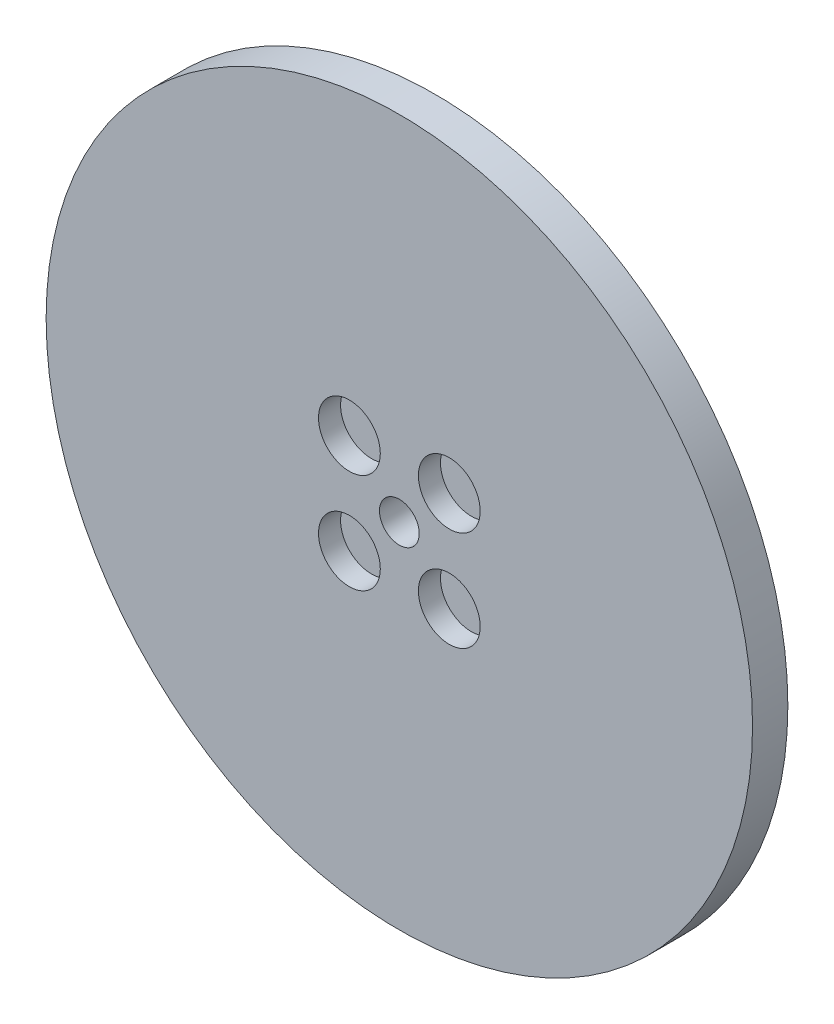
ISO-10303-21;
HEADER;
FILE_DESCRIPTION(('STEP AP214'),'2;1');
FILE_NAME('part.step','',(''),(''),'','','');
FILE_SCHEMA(('AUTOMOTIVE_DESIGN { 1 0 10303 214 1 1 1 1 }'));
ENDSEC;
DATA;
#1=APPLICATION_CONTEXT('core data for automotive mechanical design processes');
#2=APPLICATION_PROTOCOL_DEFINITION('international standard','automotive_design',2000,#1);
#3=PRODUCT_CONTEXT('',#1,'mechanical');
#4=PRODUCT('Part','Part','',(#3));
#5=PRODUCT_RELATED_PRODUCT_CATEGORY('part','',(#4));
#6=PRODUCT_DEFINITION_FORMATION('','',#4);
#7=PRODUCT_DEFINITION_CONTEXT('part definition',#1,'design');
#8=PRODUCT_DEFINITION('design','',#6,#7);
#9=PRODUCT_DEFINITION_SHAPE('','',#8);
#10=(LENGTH_UNIT() NAMED_UNIT(*) SI_UNIT(.MILLI.,.METRE.));
#11=(NAMED_UNIT(*) PLANE_ANGLE_UNIT() SI_UNIT($,.RADIAN.));
#12=(NAMED_UNIT(*) SI_UNIT($,.STERADIAN.) SOLID_ANGLE_UNIT());
#13=UNCERTAINTY_MEASURE_WITH_UNIT(LENGTH_MEASURE(1.E-05),#10,'distance_accuracy_value','');
#14=(GEOMETRIC_REPRESENTATION_CONTEXT(3) GLOBAL_UNCERTAINTY_ASSIGNED_CONTEXT((#13)) GLOBAL_UNIT_ASSIGNED_CONTEXT((#10,
#11,#12)) REPRESENTATION_CONTEXT('',''));
#15=CARTESIAN_POINT('',(0.,0.,0.));
#16=DIRECTION('',(0.,0.,1.));
#17=DIRECTION('',(1.,0.,0.));
#18=AXIS2_PLACEMENT_3D('',#15,#16,#17);
#19=CARTESIAN_POINT('',(5.65599974191923,-5.65770862800566,8.));
#20=DIRECTION('',(0.,0.,-1.));
#21=DIRECTION('',(-1.,0.,0.));
#22=AXIS2_PLACEMENT_3D('',#19,#20,#21);
#23=CYLINDRICAL_SURFACE('',#22,1.5);
#24=CARTESIAN_POINT('',(5.65599974191923,-5.65770862800566,4.));
#25=DIRECTION('',(0.,0.,1.));
#26=DIRECTION('',(1.,0.,0.));
#27=AXIS2_PLACEMENT_3D('',#24,#25,#26);
#28=CIRCLE('',#27,1.5);
#29=CARTESIAN_POINT('',(7.15599974191923,-5.65770862800566,4.));
#30=VERTEX_POINT('',#29);
#31=EDGE_CURVE('E172',#30,#30,#28,.T.);
#32=ORIENTED_EDGE('',*,*,#31,.F.);
#33=EDGE_LOOP('',(#32));
#34=FACE_BOUND('',#33,.T.);
#35=CARTESIAN_POINT('',(5.65599974191923,-5.65770862800566,5.3));
#36=DIRECTION('',(0.,0.,1.));
#37=DIRECTION('',(1.,0.,0.));
#38=AXIS2_PLACEMENT_3D('',#35,#36,#37);
#39=CIRCLE('',#38,1.5);
#40=CARTESIAN_POINT('',(7.15599974191923,-5.65770862800566,5.3));
#41=VERTEX_POINT('',#40);
#42=EDGE_CURVE('E43',#41,#41,#39,.T.);
#43=ORIENTED_EDGE('',*,*,#42,.T.);
#44=EDGE_LOOP('',(#43));
#45=FACE_BOUND('',#44,.T.);
#46=ADVANCED_FACE('F39',(#34,#45),#23,.F.);
#47=CARTESIAN_POINT('',(-5.65599974191923,-5.65770862800566,8.));
#48=DIRECTION('',(0.,0.,-1.));
#49=DIRECTION('',(-1.,0.,0.));
#50=AXIS2_PLACEMENT_3D('',#47,#48,#49);
#51=CYLINDRICAL_SURFACE('',#50,1.5);
#52=CARTESIAN_POINT('',(-5.65599974191923,-5.65770862800566,4.));
#53=DIRECTION('',(0.,0.,1.));
#54=DIRECTION('',(1.,0.,0.));
#55=AXIS2_PLACEMENT_3D('',#52,#53,#54);
#56=CIRCLE('',#55,1.5);
#57=CARTESIAN_POINT('',(-4.15599974191923,-5.65770862800566,4.));
#58=VERTEX_POINT('',#57);
#59=EDGE_CURVE('E169',#58,#58,#56,.T.);
#60=ORIENTED_EDGE('',*,*,#59,.F.);
#61=EDGE_LOOP('',(#60));
#62=FACE_BOUND('',#61,.T.);
#63=CARTESIAN_POINT('',(-5.65599974191923,-5.65770862800566,5.3));
#64=DIRECTION('',(0.,0.,1.));
#65=DIRECTION('',(1.,0.,0.));
#66=AXIS2_PLACEMENT_3D('',#63,#64,#65);
#67=CIRCLE('',#66,1.5);
#68=CARTESIAN_POINT('',(-4.15599974191923,-5.65770862800566,5.3));
#69=VERTEX_POINT('',#68);
#70=EDGE_CURVE('E63',#69,#69,#67,.T.);
#71=ORIENTED_EDGE('',*,*,#70,.T.);
#72=EDGE_LOOP('',(#71));
#73=FACE_BOUND('',#72,.T.);
#74=ADVANCED_FACE('F82',(#62,#73),#51,.F.);
#75=CARTESIAN_POINT('',(5.65599974191923,5.65770862800566,8.));
#76=DIRECTION('',(0.,0.,-1.));
#77=DIRECTION('',(-1.,0.,0.));
#78=AXIS2_PLACEMENT_3D('',#75,#76,#77);
#79=CYLINDRICAL_SURFACE('',#78,1.5);
#80=CARTESIAN_POINT('',(5.65599974191923,5.65770862800566,4.));
#81=DIRECTION('',(0.,0.,1.));
#82=DIRECTION('',(1.,0.,0.));
#83=AXIS2_PLACEMENT_3D('',#80,#81,#82);
#84=CIRCLE('',#83,1.5);
#85=CARTESIAN_POINT('',(7.15599974191923,5.65770862800566,4.));
#86=VERTEX_POINT('',#85);
#87=EDGE_CURVE('E175',#86,#86,#84,.T.);
#88=ORIENTED_EDGE('',*,*,#87,.F.);
#89=EDGE_LOOP('',(#88));
#90=FACE_BOUND('',#89,.T.);
#91=CARTESIAN_POINT('',(5.65599974191923,5.65770862800566,5.3));
#92=DIRECTION('',(0.,0.,1.));
#93=DIRECTION('',(1.,0.,0.));
#94=AXIS2_PLACEMENT_3D('',#91,#92,#93);
#95=CIRCLE('',#94,1.5);
#96=CARTESIAN_POINT('',(7.15599974191923,5.65770862800566,5.3));
#97=VERTEX_POINT('',#96);
#98=EDGE_CURVE('E61',#97,#97,#95,.T.);
#99=ORIENTED_EDGE('',*,*,#98,.T.);
#100=EDGE_LOOP('',(#99));
#101=FACE_BOUND('',#100,.T.);
#102=ADVANCED_FACE('F89',(#90,#101),#79,.F.);
#103=CARTESIAN_POINT('',(-5.65599974191923,5.65770862800566,8.));
#104=DIRECTION('',(0.,0.,-1.));
#105=DIRECTION('',(-1.,0.,0.));
#106=AXIS2_PLACEMENT_3D('',#103,#104,#105);
#107=CYLINDRICAL_SURFACE('',#106,1.5);
#108=CARTESIAN_POINT('',(-5.65599974191923,5.65770862800566,4.));
#109=DIRECTION('',(0.,0.,1.));
#110=DIRECTION('',(1.,0.,0.));
#111=AXIS2_PLACEMENT_3D('',#108,#109,#110);
#112=CIRCLE('',#111,1.5);
#113=CARTESIAN_POINT('',(-4.15599974191923,5.65770862800566,4.));
#114=VERTEX_POINT('',#113);
#115=EDGE_CURVE('E164',#114,#114,#112,.T.);
#116=ORIENTED_EDGE('',*,*,#115,.F.);
#117=EDGE_LOOP('',(#116));
#118=FACE_BOUND('',#117,.T.);
#119=CARTESIAN_POINT('',(-5.65599974191923,5.65770862800566,5.3));
#120=DIRECTION('',(0.,0.,1.));
#121=DIRECTION('',(1.,0.,0.));
#122=AXIS2_PLACEMENT_3D('',#119,#120,#121);
#123=CIRCLE('',#122,1.5);
#124=CARTESIAN_POINT('',(-4.15599974191923,5.65770862800566,5.3));
#125=VERTEX_POINT('',#124);
#126=EDGE_CURVE('E57',#125,#125,#123,.T.);
#127=ORIENTED_EDGE('',*,*,#126,.T.);
#128=EDGE_LOOP('',(#127));
#129=FACE_BOUND('',#128,.T.);
#130=ADVANCED_FACE('F96',(#118,#129),#107,.F.);
#131=CARTESIAN_POINT('',(0.,0.,0.));
#132=DIRECTION('',(0.,0.,1.));
#133=DIRECTION('',(1.,0.,0.));
#134=AXIS2_PLACEMENT_3D('',#131,#132,#133);
#135=PLANE('',#134);
#136=CARTESIAN_POINT('',(20.,0.,0.));
#137=DIRECTION('',(0.,0.,-1.));
#138=DIRECTION('',(-1.,0.,0.));
#139=AXIS2_PLACEMENT_3D('',#136,#137,#138);
#140=CIRCLE('',#139,5.15);
#141=CARTESIAN_POINT('',(14.85,0.,0.));
#142=VERTEX_POINT('',#141);
#143=EDGE_CURVE('E132',#142,#142,#140,.T.);
#144=ORIENTED_EDGE('',*,*,#143,.F.);
#145=EDGE_LOOP('',(#144));
#146=FACE_BOUND('',#145,.T.);
#147=CARTESIAN_POINT('',(0.,-20.,0.));
#148=DIRECTION('',(0.,0.,-1.));
#149=DIRECTION('',(-1.,0.,0.));
#150=AXIS2_PLACEMENT_3D('',#147,#148,#149);
#151=CIRCLE('',#150,5.15);
#152=CARTESIAN_POINT('',(-5.15000000000007,-20.,0.));
#153=VERTEX_POINT('',#152);
#154=EDGE_CURVE('E136',#153,#153,#151,.T.);
#155=ORIENTED_EDGE('',*,*,#154,.F.);
#156=EDGE_LOOP('',(#155));
#157=FACE_BOUND('',#156,.T.);
#158=CARTESIAN_POINT('',(-20.,1.39659253553725E-13,0.));
#159=DIRECTION('',(0.,0.,-1.));
#160=DIRECTION('',(-1.,0.,0.));
#161=AXIS2_PLACEMENT_3D('',#158,#159,#160);
#162=CIRCLE('',#161,5.15);
#163=CARTESIAN_POINT('',(-25.15,1.39659253553725E-13,0.));
#164=VERTEX_POINT('',#163);
#165=EDGE_CURVE('E140',#164,#164,#162,.T.);
#166=ORIENTED_EDGE('',*,*,#165,.F.);
#167=EDGE_LOOP('',(#166));
#168=FACE_BOUND('',#167,.T.);
#169=CARTESIAN_POINT('',(2.09488880330588E-13,20.,0.));
#170=DIRECTION('',(0.,0.,-1.));
#171=DIRECTION('',(-1.,0.,0.));
#172=AXIS2_PLACEMENT_3D('',#169,#170,#171);
#173=CIRCLE('',#172,5.15);
#174=CARTESIAN_POINT('',(-5.14999999999979,20.,0.));
#175=VERTEX_POINT('',#174);
#176=EDGE_CURVE('E144',#175,#175,#173,.T.);
#177=ORIENTED_EDGE('',*,*,#176,.F.);
#178=EDGE_LOOP('',(#177));
#179=FACE_BOUND('',#178,.T.);
#180=CARTESIAN_POINT('',(0.,0.,0.));
#181=DIRECTION('',(0.,0.,1.));
#182=DIRECTION('',(1.,0.,0.));
#183=AXIS2_PLACEMENT_3D('',#180,#181,#182);
#184=CIRCLE('',#183,30.);
#185=CARTESIAN_POINT('',(30.,0.,0.));
#186=VERTEX_POINT('',#185);
#187=EDGE_CURVE('E47',#186,#186,#184,.T.);
#188=ORIENTED_EDGE('',*,*,#187,.F.);
#189=EDGE_LOOP('',(#188));
#190=FACE_BOUND('',#189,.T.);
#191=CARTESIAN_POINT('',(0.,0.,0.));
#192=DIRECTION('',(0.,0.,1.));
#193=DIRECTION('',(1.,0.,0.));
#194=AXIS2_PLACEMENT_3D('',#191,#192,#193);
#195=CIRCLE('',#194,12.5);
#196=CARTESIAN_POINT('',(12.5,0.,0.));
#197=VERTEX_POINT('',#196);
#198=EDGE_CURVE('E52',#197,#197,#195,.T.);
#199=ORIENTED_EDGE('',*,*,#198,.T.);
#200=EDGE_LOOP('',(#199));
#201=FACE_BOUND('',#200,.T.);
#202=ADVANCED_FACE('F99',(#146,#157,#168,#179,#190,#201),#135,.F.);
#203=CARTESIAN_POINT('',(0.,0.,4.));
#204=DIRECTION('',(0.,0.,-1.));
#205=DIRECTION('',(-1.,0.,0.));
#206=AXIS2_PLACEMENT_3D('',#203,#204,#205);
#207=CYLINDRICAL_SURFACE('',#206,30.);
#208=CARTESIAN_POINT('',(0.,0.,4.));
#209=DIRECTION('',(0.,0.,1.));
#210=DIRECTION('',(1.,0.,0.));
#211=AXIS2_PLACEMENT_3D('',#208,#209,#210);
#212=CIRCLE('',#211,30.);
#213=CARTESIAN_POINT('',(30.,0.,4.));
#214=VERTEX_POINT('',#213);
#215=EDGE_CURVE('E10',#214,#214,#212,.T.);
#216=ORIENTED_EDGE('',*,*,#215,.F.);
#217=EDGE_LOOP('',(#216));
#218=FACE_BOUND('',#217,.T.);
#219=ORIENTED_EDGE('',*,*,#187,.T.);
#220=EDGE_LOOP('',(#219));
#221=FACE_BOUND('',#220,.T.);
#222=ADVANCED_FACE('F41',(#218,#221),#207,.T.);
#223=CARTESIAN_POINT('',(0.,0.,4.));
#224=DIRECTION('',(0.,0.,-1.));
#225=DIRECTION('',(-1.,0.,0.));
#226=AXIS2_PLACEMENT_3D('',#223,#224,#225);
#227=CYLINDRICAL_SURFACE('',#226,12.5);
#228=CARTESIAN_POINT('',(0.,0.,4.));
#229=DIRECTION('',(0.,0.,1.));
#230=DIRECTION('',(1.,0.,0.));
#231=AXIS2_PLACEMENT_3D('',#228,#229,#230);
#232=CIRCLE('',#231,12.5);
#233=CARTESIAN_POINT('',(12.5,0.,4.));
#234=VERTEX_POINT('',#233);
#235=EDGE_CURVE('E150',#234,#234,#232,.T.);
#236=ORIENTED_EDGE('',*,*,#235,.T.);
#237=EDGE_LOOP('',(#236));
#238=FACE_BOUND('',#237,.T.);
#239=ORIENTED_EDGE('',*,*,#198,.F.);
#240=EDGE_LOOP('',(#239));
#241=FACE_BOUND('',#240,.T.);
#242=ADVANCED_FACE('F118',(#238,#241),#227,.F.);
#243=CARTESIAN_POINT('',(0.,0.,4.));
#244=DIRECTION('',(0.,0.,1.));
#245=DIRECTION('',(1.,0.,0.));
#246=AXIS2_PLACEMENT_3D('',#243,#244,#245);
#247=PLANE('',#246);
#248=ORIENTED_EDGE('',*,*,#87,.T.);
#249=EDGE_LOOP('',(#248));
#250=FACE_BOUND('',#249,.T.);
#251=ORIENTED_EDGE('',*,*,#31,.T.);
#252=EDGE_LOOP('',(#251));
#253=FACE_BOUND('',#252,.T.);
#254=ORIENTED_EDGE('',*,*,#59,.T.);
#255=EDGE_LOOP('',(#254));
#256=FACE_BOUND('',#255,.T.);
#257=ORIENTED_EDGE('',*,*,#115,.T.);
#258=EDGE_LOOP('',(#257));
#259=FACE_BOUND('',#258,.T.);
#260=CARTESIAN_POINT('',(0.,0.,4.));
#261=DIRECTION('',(0.,0.,1.));
#262=DIRECTION('',(1.,0.,0.));
#263=AXIS2_PLACEMENT_3D('',#260,#261,#262);
#264=CIRCLE('',#263,2.25);
#265=CARTESIAN_POINT('',(2.25,0.,4.));
#266=VERTEX_POINT('',#265);
#267=EDGE_CURVE('E161',#266,#266,#264,.T.);
#268=ORIENTED_EDGE('',*,*,#267,.T.);
#269=EDGE_LOOP('',(#268));
#270=FACE_BOUND('',#269,.T.);
#271=ORIENTED_EDGE('',*,*,#235,.F.);
#272=EDGE_LOOP('',(#271));
#273=FACE_BOUND('',#272,.T.);
#274=ADVANCED_FACE('F111',(#250,#253,#256,#259,#270,#273),#247,.F.);
#275=CARTESIAN_POINT('',(0.,0.,8.));
#276=DIRECTION('',(0.,0.,1.));
#277=DIRECTION('',(1.,0.,0.));
#278=AXIS2_PLACEMENT_3D('',#275,#276,#277);
#279=PLANE('',#278);
#280=CARTESIAN_POINT('',(-5.65599974191923,-5.65770862800566,8.));
#281=DIRECTION('',(0.,0.,1.));
#282=DIRECTION('',(1.,0.,0.));
#283=AXIS2_PLACEMENT_3D('',#280,#281,#282);
#284=CIRCLE('',#283,3.5);
#285=CARTESIAN_POINT('',(-2.15599974191923,-5.65770862800566,8.));
#286=VERTEX_POINT('',#285);
#287=EDGE_CURVE('E188',#286,#286,#284,.T.);
#288=ORIENTED_EDGE('',*,*,#287,.F.);
#289=EDGE_LOOP('',(#288));
#290=FACE_BOUND('',#289,.T.);
#291=CARTESIAN_POINT('',(5.65599974191923,-5.65770862800566,8.));
#292=DIRECTION('',(0.,0.,1.));
#293=DIRECTION('',(1.,0.,0.));
#294=AXIS2_PLACEMENT_3D('',#291,#292,#293);
#295=CIRCLE('',#294,3.5);
#296=CARTESIAN_POINT('',(9.15599974191923,-5.65770862800566,8.));
#297=VERTEX_POINT('',#296);
#298=EDGE_CURVE('E195',#297,#297,#295,.T.);
#299=ORIENTED_EDGE('',*,*,#298,.F.);
#300=EDGE_LOOP('',(#299));
#301=FACE_BOUND('',#300,.T.);
#302=CARTESIAN_POINT('',(5.65599974191923,5.65770862800566,8.));
#303=DIRECTION('',(0.,0.,1.));
#304=DIRECTION('',(1.,0.,0.));
#305=AXIS2_PLACEMENT_3D('',#302,#303,#304);
#306=CIRCLE('',#305,3.5);
#307=CARTESIAN_POINT('',(9.15599974191923,5.65770862800566,8.));
#308=VERTEX_POINT('',#307);
#309=EDGE_CURVE('E182',#308,#308,#306,.T.);
#310=ORIENTED_EDGE('',*,*,#309,.F.);
#311=EDGE_LOOP('',(#310));
#312=FACE_BOUND('',#311,.T.);
#313=CARTESIAN_POINT('',(-5.65599974191923,5.65770862800566,8.));
#314=DIRECTION('',(0.,0.,1.));
#315=DIRECTION('',(1.,0.,0.));
#316=AXIS2_PLACEMENT_3D('',#313,#314,#315);
#317=CIRCLE('',#316,3.5);
#318=CARTESIAN_POINT('',(-2.15599974191923,5.65770862800566,8.));
#319=VERTEX_POINT('',#318);
#320=EDGE_CURVE('E179',#319,#319,#317,.T.);
#321=ORIENTED_EDGE('',*,*,#320,.F.);
#322=EDGE_LOOP('',(#321));
#323=FACE_BOUND('',#322,.T.);
#324=CARTESIAN_POINT('',(0.,0.,8.));
#325=DIRECTION('',(0.,0.,1.));
#326=DIRECTION('',(1.,0.,0.));
#327=AXIS2_PLACEMENT_3D('',#324,#325,#326);
#328=CIRCLE('',#327,40.);
#329=CARTESIAN_POINT('',(40.,0.,8.));
#330=VERTEX_POINT('',#329);
#331=EDGE_CURVE('E152',#330,#330,#328,.T.);
#332=ORIENTED_EDGE('',*,*,#331,.T.);
#333=EDGE_LOOP('',(#332));
#334=FACE_BOUND('',#333,.T.);
#335=CARTESIAN_POINT('',(0.,0.,8.));
#336=DIRECTION('',(0.,0.,1.));
#337=DIRECTION('',(1.,0.,0.));
#338=AXIS2_PLACEMENT_3D('',#335,#336,#337);
#339=CIRCLE('',#338,2.25);
#340=CARTESIAN_POINT('',(2.25,0.,8.));
#341=VERTEX_POINT('',#340);
#342=EDGE_CURVE('E159',#341,#341,#339,.T.);
#343=ORIENTED_EDGE('',*,*,#342,.F.);
#344=EDGE_LOOP('',(#343));
#345=FACE_BOUND('',#344,.T.);
#346=ADVANCED_FACE('F107',(#290,#301,#312,#323,#334,#345),#279,.T.);
#347=ORIENTED_EDGE('',*,*,#215,.T.);
#348=EDGE_LOOP('',(#347));
#349=FACE_BOUND('',#348,.T.);
#350=CARTESIAN_POINT('',(0.,0.,4.));
#351=DIRECTION('',(0.,0.,1.));
#352=DIRECTION('',(1.,0.,0.));
#353=AXIS2_PLACEMENT_3D('',#350,#351,#352);
#354=CIRCLE('',#353,40.);
#355=CARTESIAN_POINT('',(40.,0.,4.));
#356=VERTEX_POINT('',#355);
#357=EDGE_CURVE('E155',#356,#356,#354,.T.);
#358=ORIENTED_EDGE('',*,*,#357,.F.);
#359=EDGE_LOOP('',(#358));
#360=FACE_BOUND('',#359,.T.);
#361=ADVANCED_FACE('F110',(#349,#360),#247,.F.);
#362=CARTESIAN_POINT('',(0.,0.,8.));
#363=DIRECTION('',(0.,0.,-1.));
#364=DIRECTION('',(-1.,0.,0.));
#365=AXIS2_PLACEMENT_3D('',#362,#363,#364);
#366=CYLINDRICAL_SURFACE('',#365,40.);
#367=ORIENTED_EDGE('',*,*,#331,.F.);
#368=EDGE_LOOP('',(#367));
#369=FACE_BOUND('',#368,.T.);
#370=ORIENTED_EDGE('',*,*,#357,.T.);
#371=EDGE_LOOP('',(#370));
#372=FACE_BOUND('',#371,.T.);
#373=ADVANCED_FACE('F105',(#369,#372),#366,.T.);
#374=CARTESIAN_POINT('',(0.,0.,8.));
#375=DIRECTION('',(0.,0.,-1.));
#376=DIRECTION('',(-1.,0.,0.));
#377=AXIS2_PLACEMENT_3D('',#374,#375,#376);
#378=CYLINDRICAL_SURFACE('',#377,2.25);
#379=ORIENTED_EDGE('',*,*,#342,.T.);
#380=EDGE_LOOP('',(#379));
#381=FACE_BOUND('',#380,.T.);
#382=ORIENTED_EDGE('',*,*,#267,.F.);
#383=EDGE_LOOP('',(#382));
#384=FACE_BOUND('',#383,.T.);
#385=ADVANCED_FACE('F101',(#381,#384),#378,.F.);
#386=CARTESIAN_POINT('',(5.65599974191923,5.65770862800566,5.5));
#387=DIRECTION('',(0.,0.,1.));
#388=DIRECTION('',(1.,0.,0.));
#389=AXIS2_PLACEMENT_3D('',#386,#387,#388);
#390=CYLINDRICAL_SURFACE('',#389,3.5);
#391=CARTESIAN_POINT('',(5.65599974191923,5.65770862800566,5.5));
#392=DIRECTION('',(0.,0.,1.));
#393=DIRECTION('',(1.,0.,0.));
#394=AXIS2_PLACEMENT_3D('',#391,#392,#393);
#395=CIRCLE('',#394,3.5);
#396=CARTESIAN_POINT('',(9.15599974191923,5.65770862800566,5.5));
#397=VERTEX_POINT('',#396);
#398=EDGE_CURVE('E198',#397,#397,#395,.T.);
#399=ORIENTED_EDGE('',*,*,#398,.F.);
#400=EDGE_LOOP('',(#399));
#401=FACE_BOUND('',#400,.T.);
#402=ORIENTED_EDGE('',*,*,#309,.T.);
#403=EDGE_LOOP('',(#402));
#404=FACE_BOUND('',#403,.T.);
#405=ADVANCED_FACE('F104',(#401,#404),#390,.F.);
#406=CARTESIAN_POINT('',(5.65599974191923,5.65770862800566,5.5));
#407=DIRECTION('',(0.,0.,1.));
#408=DIRECTION('',(1.,0.,0.));
#409=AXIS2_PLACEMENT_3D('',#406,#407,#408);
#410=PLANE('',#409);
#411=ORIENTED_EDGE('',*,*,#398,.T.);
#412=EDGE_LOOP('',(#411));
#413=FACE_BOUND('',#412,.T.);
#414=ADVANCED_FACE('F256',(#413),#410,.T.);
#415=CARTESIAN_POINT('',(5.65599974191923,-5.65770862800566,5.5));
#416=DIRECTION('',(0.,0.,1.));
#417=DIRECTION('',(1.,0.,0.));
#418=AXIS2_PLACEMENT_3D('',#415,#416,#417);
#419=CYLINDRICAL_SURFACE('',#418,3.5);
#420=CARTESIAN_POINT('',(5.65599974191923,-5.65770862800566,5.5));
#421=DIRECTION('',(0.,0.,1.));
#422=DIRECTION('',(1.,0.,0.));
#423=AXIS2_PLACEMENT_3D('',#420,#421,#422);
#424=CIRCLE('',#423,3.5);
#425=CARTESIAN_POINT('',(9.15599974191923,-5.65770862800566,5.5));
#426=VERTEX_POINT('',#425);
#427=EDGE_CURVE('E192',#426,#426,#424,.T.);
#428=ORIENTED_EDGE('',*,*,#427,.F.);
#429=EDGE_LOOP('',(#428));
#430=FACE_BOUND('',#429,.T.);
#431=ORIENTED_EDGE('',*,*,#298,.T.);
#432=EDGE_LOOP('',(#431));
#433=FACE_BOUND('',#432,.T.);
#434=ADVANCED_FACE('F260',(#430,#433),#419,.F.);
#435=CARTESIAN_POINT('',(5.65599974191923,-5.65770862800566,5.5));
#436=DIRECTION('',(0.,0.,1.));
#437=DIRECTION('',(1.,0.,0.));
#438=AXIS2_PLACEMENT_3D('',#435,#436,#437);
#439=PLANE('',#438);
#440=ORIENTED_EDGE('',*,*,#427,.T.);
#441=EDGE_LOOP('',(#440));
#442=FACE_BOUND('',#441,.T.);
#443=ADVANCED_FACE('F264',(#442),#439,.T.);
#444=CARTESIAN_POINT('',(-5.65599974191923,-5.65770862800566,5.5));
#445=DIRECTION('',(0.,0.,1.));
#446=DIRECTION('',(1.,0.,0.));
#447=AXIS2_PLACEMENT_3D('',#444,#445,#446);
#448=CYLINDRICAL_SURFACE('',#447,3.5);
#449=CARTESIAN_POINT('',(-5.65599974191923,-5.65770862800566,5.5));
#450=DIRECTION('',(0.,0.,1.));
#451=DIRECTION('',(1.,0.,0.));
#452=AXIS2_PLACEMENT_3D('',#449,#450,#451);
#453=CIRCLE('',#452,3.5);
#454=CARTESIAN_POINT('',(-2.15599974191923,-5.65770862800566,5.5));
#455=VERTEX_POINT('',#454);
#456=EDGE_CURVE('E185',#455,#455,#453,.T.);
#457=ORIENTED_EDGE('',*,*,#456,.F.);
#458=EDGE_LOOP('',(#457));
#459=FACE_BOUND('',#458,.T.);
#460=ORIENTED_EDGE('',*,*,#287,.T.);
#461=EDGE_LOOP('',(#460));
#462=FACE_BOUND('',#461,.T.);
#463=ADVANCED_FACE('F268',(#459,#462),#448,.F.);
#464=CARTESIAN_POINT('',(-5.65599974191923,-5.65770862800566,5.5));
#465=DIRECTION('',(0.,0.,1.));
#466=DIRECTION('',(1.,0.,0.));
#467=AXIS2_PLACEMENT_3D('',#464,#465,#466);
#468=PLANE('',#467);
#469=ORIENTED_EDGE('',*,*,#456,.T.);
#470=EDGE_LOOP('',(#469));
#471=FACE_BOUND('',#470,.T.);
#472=ADVANCED_FACE('F272',(#471),#468,.T.);
#473=CARTESIAN_POINT('',(-5.65599974191923,5.65770862800566,5.5));
#474=DIRECTION('',(0.,0.,1.));
#475=DIRECTION('',(1.,0.,0.));
#476=AXIS2_PLACEMENT_3D('',#473,#474,#475);
#477=CYLINDRICAL_SURFACE('',#476,3.5);
#478=CARTESIAN_POINT('',(-5.65599974191923,5.65770862800566,5.5));
#479=DIRECTION('',(0.,0.,1.));
#480=DIRECTION('',(1.,0.,0.));
#481=AXIS2_PLACEMENT_3D('',#478,#479,#480);
#482=CIRCLE('',#481,3.5);
#483=CARTESIAN_POINT('',(-2.15599974191923,5.65770862800566,5.5));
#484=VERTEX_POINT('',#483);
#485=EDGE_CURVE('E178',#484,#484,#482,.T.);
#486=ORIENTED_EDGE('',*,*,#485,.F.);
#487=EDGE_LOOP('',(#486));
#488=FACE_BOUND('',#487,.T.);
#489=ORIENTED_EDGE('',*,*,#320,.T.);
#490=EDGE_LOOP('',(#489));
#491=FACE_BOUND('',#490,.T.);
#492=ADVANCED_FACE('F276',(#488,#491),#477,.F.);
#493=CARTESIAN_POINT('',(-5.65599974191923,5.65770862800566,5.5));
#494=DIRECTION('',(0.,0.,1.));
#495=DIRECTION('',(1.,0.,0.));
#496=AXIS2_PLACEMENT_3D('',#493,#494,#495);
#497=PLANE('',#496);
#498=ORIENTED_EDGE('',*,*,#485,.T.);
#499=EDGE_LOOP('',(#498));
#500=FACE_BOUND('',#499,.T.);
#501=ADVANCED_FACE('F249',(#500),#497,.T.);
#502=CARTESIAN_POINT('',(2.09488880330588E-13,20.,4.));
#503=DIRECTION('',(0.,0.,-1.));
#504=DIRECTION('',(-1.,0.,0.));
#505=AXIS2_PLACEMENT_3D('',#502,#503,#504);
#506=CYLINDRICAL_SURFACE('',#505,5.15);
#507=CARTESIAN_POINT('',(2.09488880330588E-13,20.,4.));
#508=DIRECTION('',(0.,0.,-1.));
#509=DIRECTION('',(-1.,0.,0.));
#510=AXIS2_PLACEMENT_3D('',#507,#508,#509);
#511=CIRCLE('',#510,5.15);
#512=CARTESIAN_POINT('',(-5.14999999999979,20.,4.));
#513=VERTEX_POINT('',#512);
#514=EDGE_CURVE('E60',#513,#513,#511,.T.);
#515=ORIENTED_EDGE('',*,*,#514,.F.);
#516=EDGE_LOOP('',(#515));
#517=FACE_BOUND('',#516,.T.);
#518=ORIENTED_EDGE('',*,*,#176,.T.);
#519=EDGE_LOOP('',(#518));
#520=FACE_BOUND('',#519,.T.);
#521=ADVANCED_FACE('F247',(#517,#520),#506,.F.);
#522=CARTESIAN_POINT('',(2.09488880330588E-13,20.,4.));
#523=DIRECTION('',(0.,0.,-1.));
#524=DIRECTION('',(-1.,0.,0.));
#525=AXIS2_PLACEMENT_3D('',#522,#523,#524);
#526=PLANE('',#525);
#527=ORIENTED_EDGE('',*,*,#514,.T.);
#528=EDGE_LOOP('',(#527));
#529=FACE_BOUND('',#528,.T.);
#530=ADVANCED_FACE('F242',(#529),#526,.T.);
#531=CARTESIAN_POINT('',(-20.,1.39659253553725E-13,4.));
#532=DIRECTION('',(0.,0.,-1.));
#533=DIRECTION('',(-1.,0.,0.));
#534=AXIS2_PLACEMENT_3D('',#531,#532,#533);
#535=CYLINDRICAL_SURFACE('',#534,5.15);
#536=CARTESIAN_POINT('',(-20.,1.39659253553725E-13,4.));
#537=DIRECTION('',(0.,0.,-1.));
#538=DIRECTION('',(-1.,0.,0.));
#539=AXIS2_PLACEMENT_3D('',#536,#537,#538);
#540=CIRCLE('',#539,5.15);
#541=CARTESIAN_POINT('',(-25.15,1.39659253553725E-13,4.));
#542=VERTEX_POINT('',#541);
#543=EDGE_CURVE('E206',#542,#542,#540,.T.);
#544=ORIENTED_EDGE('',*,*,#543,.F.);
#545=EDGE_LOOP('',(#544));
#546=FACE_BOUND('',#545,.T.);
#547=ORIENTED_EDGE('',*,*,#165,.T.);
#548=EDGE_LOOP('',(#547));
#549=FACE_BOUND('',#548,.T.);
#550=ADVANCED_FACE('F239',(#546,#549),#535,.F.);
#551=CARTESIAN_POINT('',(-20.,1.39659253553725E-13,4.));
#552=DIRECTION('',(0.,0.,-1.));
#553=DIRECTION('',(-1.,0.,0.));
#554=AXIS2_PLACEMENT_3D('',#551,#552,#553);
#555=PLANE('',#554);
#556=ORIENTED_EDGE('',*,*,#543,.T.);
#557=EDGE_LOOP('',(#556));
#558=FACE_BOUND('',#557,.T.);
#559=ADVANCED_FACE('F236',(#558),#555,.T.);
#560=CARTESIAN_POINT('',(0.,-20.,4.));
#561=DIRECTION('',(0.,0.,-1.));
#562=DIRECTION('',(-1.,0.,0.));
#563=AXIS2_PLACEMENT_3D('',#560,#561,#562);
#564=CYLINDRICAL_SURFACE('',#563,5.15);
#565=CARTESIAN_POINT('',(0.,-20.,4.));
#566=DIRECTION('',(0.,0.,-1.));
#567=DIRECTION('',(-1.,0.,0.));
#568=AXIS2_PLACEMENT_3D('',#565,#566,#567);
#569=CIRCLE('',#568,5.15);
#570=CARTESIAN_POINT('',(-5.15000000000007,-20.,4.));
#571=VERTEX_POINT('',#570);
#572=EDGE_CURVE('E210',#571,#571,#569,.T.);
#573=ORIENTED_EDGE('',*,*,#572,.F.);
#574=EDGE_LOOP('',(#573));
#575=FACE_BOUND('',#574,.T.);
#576=ORIENTED_EDGE('',*,*,#154,.T.);
#577=EDGE_LOOP('',(#576));
#578=FACE_BOUND('',#577,.T.);
#579=ADVANCED_FACE('F230',(#575,#578),#564,.F.);
#580=CARTESIAN_POINT('',(0.,-20.,4.));
#581=DIRECTION('',(0.,0.,-1.));
#582=DIRECTION('',(-1.,0.,0.));
#583=AXIS2_PLACEMENT_3D('',#580,#581,#582);
#584=PLANE('',#583);
#585=ORIENTED_EDGE('',*,*,#572,.T.);
#586=EDGE_LOOP('',(#585));
#587=FACE_BOUND('',#586,.T.);
#588=ADVANCED_FACE('F223',(#587),#584,.T.);
#589=CARTESIAN_POINT('',(20.,0.,4.));
#590=DIRECTION('',(0.,0.,-1.));
#591=DIRECTION('',(-1.,0.,0.));
#592=AXIS2_PLACEMENT_3D('',#589,#590,#591);
#593=CYLINDRICAL_SURFACE('',#592,5.15);
#594=CARTESIAN_POINT('',(20.,0.,4.));
#595=DIRECTION('',(0.,0.,-1.));
#596=DIRECTION('',(-1.,0.,0.));
#597=AXIS2_PLACEMENT_3D('',#594,#595,#596);
#598=CIRCLE('',#597,5.15);
#599=CARTESIAN_POINT('',(14.85,0.,4.));
#600=VERTEX_POINT('',#599);
#601=EDGE_CURVE('E189',#600,#600,#598,.T.);
#602=ORIENTED_EDGE('',*,*,#601,.F.);
#603=EDGE_LOOP('',(#602));
#604=FACE_BOUND('',#603,.T.);
#605=ORIENTED_EDGE('',*,*,#143,.T.);
#606=EDGE_LOOP('',(#605));
#607=FACE_BOUND('',#606,.T.);
#608=ADVANCED_FACE('F220',(#604,#607),#593,.F.);
#609=CARTESIAN_POINT('',(20.,0.,4.));
#610=DIRECTION('',(0.,0.,-1.));
#611=DIRECTION('',(-1.,0.,0.));
#612=AXIS2_PLACEMENT_3D('',#609,#610,#611);
#613=PLANE('',#612);
#614=ORIENTED_EDGE('',*,*,#601,.T.);
#615=EDGE_LOOP('',(#614));
#616=FACE_BOUND('',#615,.T.);
#617=ADVANCED_FACE('F218',(#616),#613,.T.);
#618=CARTESIAN_POINT('',(-5.65599974191923,5.65770862800566,5.3));
#619=DIRECTION('',(0.,0.,1.));
#620=DIRECTION('',(1.,0.,0.));
#621=AXIS2_PLACEMENT_3D('',#618,#619,#620);
#622=PLANE('',#621);
#623=ORIENTED_EDGE('',*,*,#126,.F.);
#624=EDGE_LOOP('',(#623));
#625=FACE_BOUND('',#624,.T.);
#626=ADVANCED_FACE('F228',(#625),#622,.F.);
#627=CARTESIAN_POINT('',(5.65599974191923,5.65770862800566,5.3));
#628=DIRECTION('',(0.,0.,1.));
#629=DIRECTION('',(1.,0.,0.));
#630=AXIS2_PLACEMENT_3D('',#627,#628,#629);
#631=PLANE('',#630);
#632=ORIENTED_EDGE('',*,*,#98,.F.);
#633=EDGE_LOOP('',(#632));
#634=FACE_BOUND('',#633,.T.);
#635=ADVANCED_FACE('F78',(#634),#631,.F.);
#636=CARTESIAN_POINT('',(-5.65599974191923,-5.65770862800566,5.3));
#637=DIRECTION('',(0.,0.,1.));
#638=DIRECTION('',(1.,0.,0.));
#639=AXIS2_PLACEMENT_3D('',#636,#637,#638);
#640=PLANE('',#639);
#641=ORIENTED_EDGE('',*,*,#70,.F.);
#642=EDGE_LOOP('',(#641));
#643=FACE_BOUND('',#642,.T.);
#644=ADVANCED_FACE('F73',(#643),#640,.F.);
#645=CARTESIAN_POINT('',(5.65599974191923,-5.65770862800566,5.3));
#646=DIRECTION('',(0.,0.,1.));
#647=DIRECTION('',(1.,0.,0.));
#648=AXIS2_PLACEMENT_3D('',#645,#646,#647);
#649=PLANE('',#648);
#650=ORIENTED_EDGE('',*,*,#42,.F.);
#651=EDGE_LOOP('',(#650));
#652=FACE_BOUND('',#651,.T.);
#653=ADVANCED_FACE('F71',(#652),#649,.F.);
#654=CLOSED_SHELL('',(#46,#74,#102,#130,#202,#222,#242,#274,#346,#361,#373,#385,#405,#414,#434,
#443,#463,#472,#492,#501,#521,#530,#550,#559,#579,#588,#608,#617,#626,#635,#644,#653));
#655=MANIFOLD_SOLID_BREP('B2',#654);
#656=ADVANCED_BREP_SHAPE_REPRESENTATION('',(#18,#655),#14);
#657=SHAPE_DEFINITION_REPRESENTATION(#9,#656);
ENDSEC;
END-ISO-10303-21;
